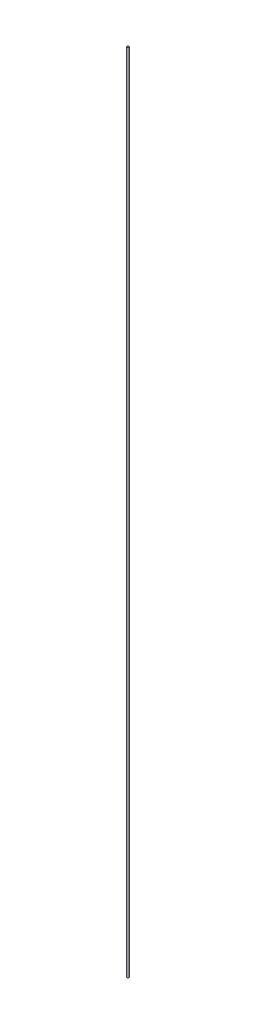
ISO-10303-21;
HEADER;
FILE_DESCRIPTION(('STEP AP214'),'2;1');
FILE_NAME('part.step','',(''),(''),'','','');
FILE_SCHEMA(('AUTOMOTIVE_DESIGN { 1 0 10303 214 1 1 1 1 }'));
ENDSEC;
DATA;
#1=APPLICATION_CONTEXT('core data for automotive mechanical design processes');
#2=APPLICATION_PROTOCOL_DEFINITION('international standard','automotive_design',2000,#1);
#3=PRODUCT_CONTEXT('',#1,'mechanical');
#4=PRODUCT('Part','Part','',(#3));
#5=PRODUCT_RELATED_PRODUCT_CATEGORY('part','',(#4));
#6=PRODUCT_DEFINITION_FORMATION('','',#4);
#7=PRODUCT_DEFINITION_CONTEXT('part definition',#1,'design');
#8=PRODUCT_DEFINITION('design','',#6,#7);
#9=PRODUCT_DEFINITION_SHAPE('','',#8);
#10=(LENGTH_UNIT() NAMED_UNIT(*) SI_UNIT(.MILLI.,.METRE.));
#11=(NAMED_UNIT(*) PLANE_ANGLE_UNIT() SI_UNIT($,.RADIAN.));
#12=(NAMED_UNIT(*) SI_UNIT($,.STERADIAN.) SOLID_ANGLE_UNIT());
#13=UNCERTAINTY_MEASURE_WITH_UNIT(LENGTH_MEASURE(1.E-05),#10,'distance_accuracy_value','');
#14=(GEOMETRIC_REPRESENTATION_CONTEXT(3) GLOBAL_UNCERTAINTY_ASSIGNED_CONTEXT((#13)) GLOBAL_UNIT_ASSIGNED_CONTEXT((#10,
#11,#12)) REPRESENTATION_CONTEXT('',''));
#15=CARTESIAN_POINT('',(0.,0.,0.));
#16=DIRECTION('',(0.,0.,1.));
#17=DIRECTION('',(1.,0.,0.));
#18=AXIS2_PLACEMENT_3D('',#15,#16,#17);
#19=CARTESIAN_POINT('',(0.,2089.35,0.));
#20=DIRECTION('',(0.,1.,0.));
#21=DIRECTION('',(0.,0.,1.));
#22=AXIS2_PLACEMENT_3D('',#19,#20,#21);
#23=PLANE('',#22);
#24=CARTESIAN_POINT('',(0.,2089.35,0.));
#25=DIRECTION('',(0.,1.,0.));
#26=DIRECTION('',(0.,0.,1.));
#27=AXIS2_PLACEMENT_3D('',#24,#25,#26);
#28=CIRCLE('',#27,5.59);
#29=CARTESIAN_POINT('',(0.,2089.35,5.59));
#30=VERTEX_POINT('',#29);
#31=EDGE_CURVE('E10',#30,#30,#28,.T.);
#32=ORIENTED_EDGE('',*,*,#31,.T.);
#33=EDGE_LOOP('',(#32));
#34=FACE_BOUND('',#33,.T.);
#35=CARTESIAN_POINT('',(0.,2089.35,0.));
#36=DIRECTION('',(0.,1.,0.));
#37=DIRECTION('',(0.,0.,1.));
#38=AXIS2_PLACEMENT_3D('',#35,#36,#37);
#39=CIRCLE('',#38,4.88);
#40=CARTESIAN_POINT('',(0.,2089.35,4.88));
#41=VERTEX_POINT('',#40);
#42=EDGE_CURVE('E44',#41,#41,#39,.T.);
#43=ORIENTED_EDGE('',*,*,#42,.F.);
#44=EDGE_LOOP('',(#43));
#45=FACE_BOUND('',#44,.T.);
#46=ADVANCED_FACE('F33',(#34,#45),#23,.T.);
#47=CARTESIAN_POINT('',(0.,-2089.35,0.));
#48=DIRECTION('',(0.,1.,0.));
#49=DIRECTION('',(0.,0.,1.));
#50=AXIS2_PLACEMENT_3D('',#47,#48,#49);
#51=PLANE('',#50);
#52=CARTESIAN_POINT('',(0.,-2089.35,0.));
#53=DIRECTION('',(0.,1.,0.));
#54=DIRECTION('',(0.,0.,1.));
#55=AXIS2_PLACEMENT_3D('',#52,#53,#54);
#56=CIRCLE('',#55,5.59);
#57=CARTESIAN_POINT('',(0.,-2089.35,5.59));
#58=VERTEX_POINT('',#57);
#59=EDGE_CURVE('E37',#58,#58,#56,.T.);
#60=ORIENTED_EDGE('',*,*,#59,.F.);
#61=EDGE_LOOP('',(#60));
#62=FACE_BOUND('',#61,.T.);
#63=CARTESIAN_POINT('',(0.,-2089.35,0.));
#64=DIRECTION('',(0.,1.,0.));
#65=DIRECTION('',(0.,0.,1.));
#66=AXIS2_PLACEMENT_3D('',#63,#64,#65);
#67=CIRCLE('',#66,4.88);
#68=CARTESIAN_POINT('',(0.,-2089.35,4.88));
#69=VERTEX_POINT('',#68);
#70=EDGE_CURVE('E46',#69,#69,#67,.T.);
#71=ORIENTED_EDGE('',*,*,#70,.T.);
#72=EDGE_LOOP('',(#71));
#73=FACE_BOUND('',#72,.T.);
#74=ADVANCED_FACE('F56',(#62,#73),#51,.F.);
#75=CARTESIAN_POINT('',(0.,2089.35,0.));
#76=DIRECTION('',(0.,-1.,0.));
#77=DIRECTION('',(0.,0.,-1.));
#78=AXIS2_PLACEMENT_3D('',#75,#76,#77);
#79=CYLINDRICAL_SURFACE('',#78,5.59);
#80=ORIENTED_EDGE('',*,*,#31,.F.);
#81=EDGE_LOOP('',(#80));
#82=FACE_BOUND('',#81,.T.);
#83=ORIENTED_EDGE('',*,*,#59,.T.);
#84=EDGE_LOOP('',(#83));
#85=FACE_BOUND('',#84,.T.);
#86=ADVANCED_FACE('F35',(#82,#85),#79,.T.);
#87=CARTESIAN_POINT('',(0.,2089.35,0.));
#88=DIRECTION('',(0.,-1.,0.));
#89=DIRECTION('',(0.,0.,-1.));
#90=AXIS2_PLACEMENT_3D('',#87,#88,#89);
#91=CYLINDRICAL_SURFACE('',#90,4.88);
#92=ORIENTED_EDGE('',*,*,#42,.T.);
#93=EDGE_LOOP('',(#92));
#94=FACE_BOUND('',#93,.T.);
#95=ORIENTED_EDGE('',*,*,#70,.F.);
#96=EDGE_LOOP('',(#95));
#97=FACE_BOUND('',#96,.T.);
#98=ADVANCED_FACE('F52',(#94,#97),#91,.F.);
#99=CLOSED_SHELL('',(#46,#74,#86,#98));
#100=MANIFOLD_SOLID_BREP('B2',#99);
#101=ADVANCED_BREP_SHAPE_REPRESENTATION('',(#18,#100),#14);
#102=SHAPE_DEFINITION_REPRESENTATION(#9,#101);
ENDSEC;
END-ISO-10303-21;
